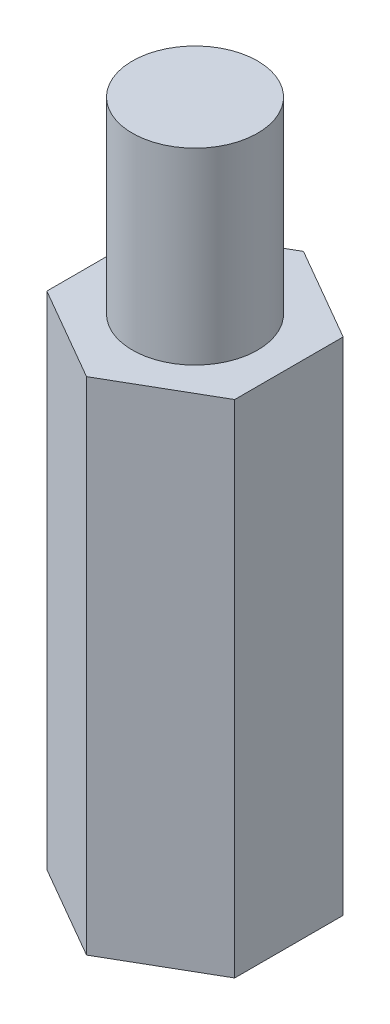
ISO-10303-21;
HEADER;
FILE_DESCRIPTION(('STEP AP214'),'2;1');
FILE_NAME('part.step','',(''),(''),'','','');
FILE_SCHEMA(('AUTOMOTIVE_DESIGN { 1 0 10303 214 1 1 1 1 }'));
ENDSEC;
DATA;
#1=APPLICATION_CONTEXT('core data for automotive mechanical design processes');
#2=APPLICATION_PROTOCOL_DEFINITION('international standard','automotive_design',2000,#1);
#3=PRODUCT_CONTEXT('',#1,'mechanical');
#4=PRODUCT('Part','Part','',(#3));
#5=PRODUCT_RELATED_PRODUCT_CATEGORY('part','',(#4));
#6=PRODUCT_DEFINITION_FORMATION('','',#4);
#7=PRODUCT_DEFINITION_CONTEXT('part definition',#1,'design');
#8=PRODUCT_DEFINITION('design','',#6,#7);
#9=PRODUCT_DEFINITION_SHAPE('','',#8);
#10=(LENGTH_UNIT() NAMED_UNIT(*) SI_UNIT(.MILLI.,.METRE.));
#11=(NAMED_UNIT(*) PLANE_ANGLE_UNIT() SI_UNIT($,.RADIAN.));
#12=(NAMED_UNIT(*) SI_UNIT($,.STERADIAN.) SOLID_ANGLE_UNIT());
#13=UNCERTAINTY_MEASURE_WITH_UNIT(LENGTH_MEASURE(1.E-05),#10,'distance_accuracy_value','');
#14=(GEOMETRIC_REPRESENTATION_CONTEXT(3) GLOBAL_UNCERTAINTY_ASSIGNED_CONTEXT((#13)) GLOBAL_UNIT_ASSIGNED_CONTEXT((#10,
#11,#12)) REPRESENTATION_CONTEXT('',''));
#15=CARTESIAN_POINT('',(0.,0.,0.));
#16=DIRECTION('',(0.,0.,1.));
#17=DIRECTION('',(1.,0.,0.));
#18=AXIS2_PLACEMENT_3D('',#15,#16,#17);
#19=CARTESIAN_POINT('',(4.7625,25.4,-2.74963065701559));
#20=DIRECTION('',(-0.5,0.,0.866025403784439));
#21=DIRECTION('',(0.866025403784439,0.,0.5));
#22=AXIS2_PLACEMENT_3D('',#19,#20,#21);
#23=PLANE('',#22);
#24=DIRECTION('',(-0.866025403784439,0.,-0.5));
#25=VECTOR('',#24,1.);
#26=CARTESIAN_POINT('',(4.7625,0.,-2.74963065701559));
#27=LINE('',#26,#25);
#28=CARTESIAN_POINT('',(4.7625,0.,-2.74963065701559));
#29=VERTEX_POINT('',#28);
#30=CARTESIAN_POINT('',(0.,0.,-5.49926131403118));
#31=VERTEX_POINT('',#30);
#32=EDGE_CURVE('E116',#29,#31,#27,.T.);
#33=ORIENTED_EDGE('',*,*,#32,.T.);
#34=DIRECTION('',(0.,-1.,0.));
#35=VECTOR('',#34,1.);
#36=CARTESIAN_POINT('',(0.,25.4,-5.49926131403118));
#37=LINE('',#36,#35);
#38=CARTESIAN_POINT('',(0.,25.4,-5.49926131403118));
#39=VERTEX_POINT('',#38);
#40=EDGE_CURVE('E11',#39,#31,#37,.T.);
#41=ORIENTED_EDGE('',*,*,#40,.F.);
#42=DIRECTION('',(-0.866025403784439,0.,-0.5));
#43=VECTOR('',#42,1.);
#44=CARTESIAN_POINT('',(4.7625,25.4,-2.74963065701559));
#45=LINE('',#44,#43);
#46=CARTESIAN_POINT('',(4.7625,25.4,-2.74963065701559));
#47=VERTEX_POINT('',#46);
#48=EDGE_CURVE('E127',#47,#39,#45,.T.);
#49=ORIENTED_EDGE('',*,*,#48,.F.);
#50=DIRECTION('',(0.,-1.,0.));
#51=VECTOR('',#50,1.);
#52=CARTESIAN_POINT('',(4.7625,25.4,-2.74963065701559));
#53=LINE('',#52,#51);
#54=EDGE_CURVE('E112',#47,#29,#53,.T.);
#55=ORIENTED_EDGE('',*,*,#54,.T.);
#56=EDGE_LOOP('',(#33,#41,#49,#55));
#57=FACE_BOUND('',#56,.T.);
#58=ADVANCED_FACE('F32',(#57),#23,.F.);
#59=CARTESIAN_POINT('',(0.,25.4,-5.49926131403118));
#60=DIRECTION('',(0.5,0.,0.866025403784439));
#61=DIRECTION('',(0.866025403784439,0.,-0.5));
#62=AXIS2_PLACEMENT_3D('',#59,#60,#61);
#63=PLANE('',#62);
#64=DIRECTION('',(-0.866025403784439,0.,0.5));
#65=VECTOR('',#64,1.);
#66=CARTESIAN_POINT('',(0.,0.,-5.49926131403118));
#67=LINE('',#66,#65);
#68=CARTESIAN_POINT('',(-4.7625,0.,-2.74963065701559));
#69=VERTEX_POINT('',#68);
#70=EDGE_CURVE('E119',#31,#69,#67,.T.);
#71=ORIENTED_EDGE('',*,*,#70,.T.);
#72=DIRECTION('',(0.,-1.,0.));
#73=VECTOR('',#72,1.);
#74=CARTESIAN_POINT('',(-4.7625,25.4,-2.74963065701559));
#75=LINE('',#74,#73);
#76=CARTESIAN_POINT('',(-4.7625,25.4,-2.74963065701559));
#77=VERTEX_POINT('',#76);
#78=EDGE_CURVE('E40',#77,#69,#75,.T.);
#79=ORIENTED_EDGE('',*,*,#78,.F.);
#80=DIRECTION('',(-0.866025403784439,0.,0.5));
#81=VECTOR('',#80,1.);
#82=CARTESIAN_POINT('',(0.,25.4,-5.49926131403118));
#83=LINE('',#82,#81);
#84=EDGE_CURVE('E85',#39,#77,#83,.T.);
#85=ORIENTED_EDGE('',*,*,#84,.F.);
#86=ORIENTED_EDGE('',*,*,#40,.T.);
#87=EDGE_LOOP('',(#71,#79,#85,#86));
#88=FACE_BOUND('',#87,.T.);
#89=ADVANCED_FACE('F152',(#88),#63,.F.);
#90=CARTESIAN_POINT('',(-4.7625,25.4,-2.74963065701559));
#91=DIRECTION('',(1.,0.,0.));
#92=DIRECTION('',(0.,0.,-1.));
#93=AXIS2_PLACEMENT_3D('',#90,#91,#92);
#94=PLANE('',#93);
#95=DIRECTION('',(0.,0.,1.));
#96=VECTOR('',#95,1.);
#97=CARTESIAN_POINT('',(-4.7625,0.,-2.74963065701559));
#98=LINE('',#97,#96);
#99=CARTESIAN_POINT('',(-4.7625,0.,2.74963065701559));
#100=VERTEX_POINT('',#99);
#101=EDGE_CURVE('E122',#69,#100,#98,.T.);
#102=ORIENTED_EDGE('',*,*,#101,.T.);
#103=DIRECTION('',(0.,-1.,0.));
#104=VECTOR('',#103,1.);
#105=CARTESIAN_POINT('',(-4.7625,25.4,2.74963065701559));
#106=LINE('',#105,#104);
#107=CARTESIAN_POINT('',(-4.7625,25.4,2.74963065701559));
#108=VERTEX_POINT('',#107);
#109=EDGE_CURVE('E107',#108,#100,#106,.T.);
#110=ORIENTED_EDGE('',*,*,#109,.F.);
#111=DIRECTION('',(0.,0.,1.));
#112=VECTOR('',#111,1.);
#113=CARTESIAN_POINT('',(-4.7625,25.4,-2.74963065701559));
#114=LINE('',#113,#112);
#115=EDGE_CURVE('E98',#77,#108,#114,.T.);
#116=ORIENTED_EDGE('',*,*,#115,.F.);
#117=ORIENTED_EDGE('',*,*,#78,.T.);
#118=EDGE_LOOP('',(#102,#110,#116,#117));
#119=FACE_BOUND('',#118,.T.);
#120=ADVANCED_FACE('F133',(#119),#94,.F.);
#121=CARTESIAN_POINT('',(-4.7625,25.4,2.74963065701559));
#122=DIRECTION('',(0.5,0.,-0.866025403784439));
#123=DIRECTION('',(-0.866025403784439,0.,-0.5));
#124=AXIS2_PLACEMENT_3D('',#121,#122,#123);
#125=PLANE('',#124);
#126=DIRECTION('',(0.866025403784439,0.,0.5));
#127=VECTOR('',#126,1.);
#128=CARTESIAN_POINT('',(-4.7625,0.,2.74963065701559));
#129=LINE('',#128,#127);
#130=CARTESIAN_POINT('',(0.,0.,5.49926131403118));
#131=VERTEX_POINT('',#130);
#132=EDGE_CURVE('E106',#100,#131,#129,.T.);
#133=ORIENTED_EDGE('',*,*,#132,.T.);
#134=DIRECTION('',(0.,-1.,0.));
#135=VECTOR('',#134,1.);
#136=CARTESIAN_POINT('',(0.,25.4,5.49926131403118));
#137=LINE('',#136,#135);
#138=CARTESIAN_POINT('',(0.,25.4,5.49926131403118));
#139=VERTEX_POINT('',#138);
#140=EDGE_CURVE('E103',#139,#131,#137,.T.);
#141=ORIENTED_EDGE('',*,*,#140,.F.);
#142=DIRECTION('',(0.866025403784439,0.,0.5));
#143=VECTOR('',#142,1.);
#144=CARTESIAN_POINT('',(-4.7625,25.4,2.74963065701559));
#145=LINE('',#144,#143);
#146=EDGE_CURVE('E92',#108,#139,#145,.T.);
#147=ORIENTED_EDGE('',*,*,#146,.F.);
#148=ORIENTED_EDGE('',*,*,#109,.T.);
#149=EDGE_LOOP('',(#133,#141,#147,#148));
#150=FACE_BOUND('',#149,.T.);
#151=ADVANCED_FACE('F104',(#150),#125,.F.);
#152=CARTESIAN_POINT('',(0.,25.4,5.49926131403118));
#153=DIRECTION('',(-0.5,0.,-0.866025403784439));
#154=DIRECTION('',(-0.866025403784439,0.,0.5));
#155=AXIS2_PLACEMENT_3D('',#152,#153,#154);
#156=PLANE('',#155);
#157=DIRECTION('',(0.866025403784439,0.,-0.5));
#158=VECTOR('',#157,1.);
#159=CARTESIAN_POINT('',(0.,0.,5.49926131403118));
#160=LINE('',#159,#158);
#161=CARTESIAN_POINT('',(4.7625,0.,2.74963065701559));
#162=VERTEX_POINT('',#161);
#163=EDGE_CURVE('E71',#131,#162,#160,.T.);
#164=ORIENTED_EDGE('',*,*,#163,.T.);
#165=DIRECTION('',(0.,-1.,0.));
#166=VECTOR('',#165,1.);
#167=CARTESIAN_POINT('',(4.7625,25.4,2.74963065701559));
#168=LINE('',#167,#166);
#169=CARTESIAN_POINT('',(4.7625,25.4,2.74963065701559));
#170=VERTEX_POINT('',#169);
#171=EDGE_CURVE('E108',#170,#162,#168,.T.);
#172=ORIENTED_EDGE('',*,*,#171,.F.);
#173=DIRECTION('',(0.866025403784439,0.,-0.5));
#174=VECTOR('',#173,1.);
#175=CARTESIAN_POINT('',(0.,25.4,5.49926131403118));
#176=LINE('',#175,#174);
#177=EDGE_CURVE('E96',#139,#170,#176,.T.);
#178=ORIENTED_EDGE('',*,*,#177,.F.);
#179=ORIENTED_EDGE('',*,*,#140,.T.);
#180=EDGE_LOOP('',(#164,#172,#178,#179));
#181=FACE_BOUND('',#180,.T.);
#182=ADVANCED_FACE('F110',(#181),#156,.F.);
#183=CARTESIAN_POINT('',(4.7625,25.4,2.74963065701559));
#184=DIRECTION('',(-1.,0.,0.));
#185=DIRECTION('',(0.,0.,1.));
#186=AXIS2_PLACEMENT_3D('',#183,#184,#185);
#187=PLANE('',#186);
#188=DIRECTION('',(0.,0.,-1.));
#189=VECTOR('',#188,1.);
#190=CARTESIAN_POINT('',(4.7625,0.,2.74963065701559));
#191=LINE('',#190,#189);
#192=EDGE_CURVE('E77',#162,#29,#191,.T.);
#193=ORIENTED_EDGE('',*,*,#192,.T.);
#194=ORIENTED_EDGE('',*,*,#54,.F.);
#195=DIRECTION('',(0.,0.,-1.));
#196=VECTOR('',#195,1.);
#197=CARTESIAN_POINT('',(4.7625,25.4,2.74963065701559));
#198=LINE('',#197,#196);
#199=EDGE_CURVE('E48',#170,#47,#198,.T.);
#200=ORIENTED_EDGE('',*,*,#199,.F.);
#201=ORIENTED_EDGE('',*,*,#171,.T.);
#202=EDGE_LOOP('',(#193,#194,#200,#201));
#203=FACE_BOUND('',#202,.T.);
#204=ADVANCED_FACE('F140',(#203),#187,.F.);
#205=CARTESIAN_POINT('',(0.,25.4,0.));
#206=DIRECTION('',(0.,1.,0.));
#207=DIRECTION('',(0.,0.,1.));
#208=AXIS2_PLACEMENT_3D('',#205,#206,#207);
#209=PLANE('',#208);
#210=CARTESIAN_POINT('',(0.,25.4,0.));
#211=DIRECTION('',(0.,1.,0.));
#212=DIRECTION('',(0.,0.,1.));
#213=AXIS2_PLACEMENT_3D('',#210,#211,#212);
#214=CIRCLE('',#213,3.175);
#215=CARTESIAN_POINT('',(0.,25.4,-3.175));
#216=VERTEX_POINT('',#215);
#217=EDGE_CURVE('E236',#216,#216,#214,.T.);
#218=ORIENTED_EDGE('',*,*,#217,.F.);
#219=EDGE_LOOP('',(#218));
#220=FACE_BOUND('',#219,.T.);
#221=ORIENTED_EDGE('',*,*,#48,.T.);
#222=ORIENTED_EDGE('',*,*,#84,.T.);
#223=ORIENTED_EDGE('',*,*,#115,.T.);
#224=ORIENTED_EDGE('',*,*,#146,.T.);
#225=ORIENTED_EDGE('',*,*,#177,.T.);
#226=ORIENTED_EDGE('',*,*,#199,.T.);
#227=EDGE_LOOP('',(#221,#222,#223,#224,#225,#226));
#228=FACE_BOUND('',#227,.T.);
#229=ADVANCED_FACE('F94',(#220,#228),#209,.T.);
#230=CARTESIAN_POINT('',(0.,0.,0.));
#231=DIRECTION('',(0.,1.,0.));
#232=DIRECTION('',(0.,0.,1.));
#233=AXIS2_PLACEMENT_3D('',#230,#231,#232);
#234=PLANE('',#233);
#235=CARTESIAN_POINT('',(0.,0.,0.));
#236=DIRECTION('',(0.,-1.,0.));
#237=DIRECTION('',(0.,0.,-1.));
#238=AXIS2_PLACEMENT_3D('',#235,#236,#237);
#239=CIRCLE('',#238,3.175);
#240=CARTESIAN_POINT('',(0.,0.,-3.175));
#241=VERTEX_POINT('',#240);
#242=EDGE_CURVE('E235',#241,#241,#239,.T.);
#243=ORIENTED_EDGE('',*,*,#242,.F.);
#244=EDGE_LOOP('',(#243));
#245=FACE_BOUND('',#244,.T.);
#246=ORIENTED_EDGE('',*,*,#32,.F.);
#247=ORIENTED_EDGE('',*,*,#192,.F.);
#248=ORIENTED_EDGE('',*,*,#163,.F.);
#249=ORIENTED_EDGE('',*,*,#132,.F.);
#250=ORIENTED_EDGE('',*,*,#101,.F.);
#251=ORIENTED_EDGE('',*,*,#70,.F.);
#252=EDGE_LOOP('',(#246,#247,#248,#249,#250,#251));
#253=FACE_BOUND('',#252,.T.);
#254=ADVANCED_FACE('F136',(#245,#253),#234,.F.);
#255=CARTESIAN_POINT('',(0.,12.7,0.));
#256=DIRECTION('',(0.,-1.,0.));
#257=DIRECTION('',(0.,0.,-1.));
#258=AXIS2_PLACEMENT_3D('',#255,#256,#257);
#259=CYLINDRICAL_SURFACE('',#258,3.175);
#260=CARTESIAN_POINT('',(0.,12.7,0.));
#261=DIRECTION('',(0.,-1.,0.));
#262=DIRECTION('',(0.,0.,-1.));
#263=AXIS2_PLACEMENT_3D('',#260,#261,#262);
#264=CIRCLE('',#263,3.175);
#265=CARTESIAN_POINT('',(0.,12.7,-3.175));
#266=VERTEX_POINT('',#265);
#267=EDGE_CURVE('E120',#266,#266,#264,.T.);
#268=ORIENTED_EDGE('',*,*,#267,.F.);
#269=EDGE_LOOP('',(#268));
#270=FACE_BOUND('',#269,.T.);
#271=ORIENTED_EDGE('',*,*,#242,.T.);
#272=EDGE_LOOP('',(#271));
#273=FACE_BOUND('',#272,.T.);
#274=ADVANCED_FACE('F184',(#270,#273),#259,.F.);
#275=CARTESIAN_POINT('',(0.,12.7,0.));
#276=DIRECTION('',(0.,-1.,0.));
#277=DIRECTION('',(0.,0.,-1.));
#278=AXIS2_PLACEMENT_3D('',#275,#276,#277);
#279=PLANE('',#278);
#280=ORIENTED_EDGE('',*,*,#267,.T.);
#281=EDGE_LOOP('',(#280));
#282=FACE_BOUND('',#281,.T.);
#283=ADVANCED_FACE('F193',(#282),#279,.T.);
#284=CARTESIAN_POINT('',(0.,34.925,0.));
#285=DIRECTION('',(0.,-1.,0.));
#286=DIRECTION('',(0.,0.,-1.));
#287=AXIS2_PLACEMENT_3D('',#284,#285,#286);
#288=CYLINDRICAL_SURFACE('',#287,3.175);
#289=CARTESIAN_POINT('',(0.,34.925,0.));
#290=DIRECTION('',(0.,1.,0.));
#291=DIRECTION('',(0.,0.,1.));
#292=AXIS2_PLACEMENT_3D('',#289,#290,#291);
#293=CIRCLE('',#292,3.175);
#294=CARTESIAN_POINT('',(0.,34.925,-3.175));
#295=VERTEX_POINT('',#294);
#296=EDGE_CURVE('E234',#295,#295,#293,.T.);
#297=CARTESIAN_POINT('',(0.,34.925,-3.175));
#298=CARTESIAN_POINT('',(0.,34.82578125,-3.175));
#299=CARTESIAN_POINT('',(0.,34.7265625,-3.175));
#300=CARTESIAN_POINT('',(0.,34.528125,-3.175));
#301=CARTESIAN_POINT('',(0.,34.42890625,-3.175));
#302=CARTESIAN_POINT('',(0.,34.23046875,-3.175));
#303=CARTESIAN_POINT('',(0.,34.13125,-3.175));
#304=CARTESIAN_POINT('',(0.,33.9328125,-3.175));
#305=CARTESIAN_POINT('',(0.,33.83359375,-3.175));
#306=CARTESIAN_POINT('',(0.,33.63515625,-3.175));
#307=CARTESIAN_POINT('',(0.,33.5359375,-3.175));
#308=CARTESIAN_POINT('',(0.,33.3375,-3.175));
#309=CARTESIAN_POINT('',(0.,33.23828125,-3.175));
#310=CARTESIAN_POINT('',(0.,33.03984375,-3.175));
#311=CARTESIAN_POINT('',(0.,32.940625,-3.175));
#312=CARTESIAN_POINT('',(0.,32.7421875,-3.175));
#313=CARTESIAN_POINT('',(0.,32.64296875,-3.175));
#314=CARTESIAN_POINT('',(0.,32.44453125,-3.175));
#315=CARTESIAN_POINT('',(0.,32.3453125,-3.175));
#316=CARTESIAN_POINT('',(0.,32.146875,-3.175));
#317=CARTESIAN_POINT('',(0.,32.04765625,-3.175));
#318=CARTESIAN_POINT('',(0.,31.84921875,-3.175));
#319=CARTESIAN_POINT('',(0.,31.75,-3.175));
#320=CARTESIAN_POINT('',(0.,31.5515625,-3.175));
#321=CARTESIAN_POINT('',(0.,31.45234375,-3.175));
#322=CARTESIAN_POINT('',(0.,31.25390625,-3.175));
#323=CARTESIAN_POINT('',(0.,31.1546875,-3.175));
#324=CARTESIAN_POINT('',(0.,30.95625,-3.175));
#325=CARTESIAN_POINT('',(0.,30.85703125,-3.175));
#326=CARTESIAN_POINT('',(0.,30.65859375,-3.175));
#327=CARTESIAN_POINT('',(0.,30.559375,-3.175));
#328=CARTESIAN_POINT('',(0.,30.3609375,-3.175));
#329=CARTESIAN_POINT('',(0.,30.26171875,-3.175));
#330=CARTESIAN_POINT('',(0.,30.06328125,-3.175));
#331=CARTESIAN_POINT('',(0.,29.9640625,-3.175));
#332=CARTESIAN_POINT('',(0.,29.765625,-3.175));
#333=CARTESIAN_POINT('',(0.,29.66640625,-3.175));
#334=CARTESIAN_POINT('',(0.,29.46796875,-3.175));
#335=CARTESIAN_POINT('',(0.,29.36875,-3.175));
#336=CARTESIAN_POINT('',(0.,29.1703125,-3.175));
#337=CARTESIAN_POINT('',(0.,29.07109375,-3.175));
#338=CARTESIAN_POINT('',(0.,28.87265625,-3.175));
#339=CARTESIAN_POINT('',(0.,28.7734375,-3.175));
#340=CARTESIAN_POINT('',(0.,28.575,-3.175));
#341=CARTESIAN_POINT('',(0.,28.47578125,-3.175));
#342=CARTESIAN_POINT('',(0.,28.27734375,-3.175));
#343=CARTESIAN_POINT('',(0.,28.178125,-3.175));
#344=CARTESIAN_POINT('',(0.,27.9796875,-3.175));
#345=CARTESIAN_POINT('',(0.,27.88046875,-3.175));
#346=CARTESIAN_POINT('',(0.,27.68203125,-3.175));
#347=CARTESIAN_POINT('',(0.,27.5828125,-3.175));
#348=CARTESIAN_POINT('',(0.,27.384375,-3.175));
#349=CARTESIAN_POINT('',(0.,27.28515625,-3.175));
#350=CARTESIAN_POINT('',(0.,27.08671875,-3.175));
#351=CARTESIAN_POINT('',(0.,26.9875,-3.175));
#352=CARTESIAN_POINT('',(0.,26.7890625,-3.175));
#353=CARTESIAN_POINT('',(0.,26.68984375,-3.175));
#354=CARTESIAN_POINT('',(0.,26.49140625,-3.175));
#355=CARTESIAN_POINT('',(0.,26.3921875,-3.175));
#356=CARTESIAN_POINT('',(0.,26.19375,-3.175));
#357=CARTESIAN_POINT('',(0.,26.09453125,-3.175));
#358=CARTESIAN_POINT('',(0.,25.89609375,-3.175));
#359=CARTESIAN_POINT('',(0.,25.796875,-3.175));
#360=CARTESIAN_POINT('',(0.,25.5984375,-3.175));
#361=CARTESIAN_POINT('',(0.,25.49921875,-3.175));
#362=CARTESIAN_POINT('',(0.,25.4,-3.175));
#363=B_SPLINE_CURVE_WITH_KNOTS('',3,(#297,#298,#299,#300,#301,#302,#303,#304,#305,#306,#307,
#308,#309,#310,#311,#312,#313,#314,#315,#316,#317,#318,#319,#320,#321,#322,#323,#324,#325,#326,
#327,#328,#329,#330,#331,#332,#333,#334,#335,#336,#337,#338,#339,#340,#341,#342,#343,#344,#345,
#346,#347,#348,#349,#350,#351,#352,#353,#354,#355,#356,#357,#358,#359,#360,#361,#362),
.UNSPECIFIED.,.F.,.F.,(4,2,2,2,2,2,2,2,2,2,2,2,2,2,2,2,2,2,2,2,2,2,2,2,2,2,2,2,2,2,2,2,4),(0.,
0.297656249999993,0.595312499999993,0.892968749999994,1.19062499999999,1.48828124999999,
1.78593749999999,2.08359374999999,2.38124999999999,2.67890624999999,2.97656249999999,
3.27421874999999,3.571875,3.86953125,4.1671875,4.46484375,4.7625,5.06015625,5.3578125,
5.65546875,5.953125,6.25078125,6.54843749999999,6.84609374999999,7.14374999999999,
7.44140624999999,7.73906249999999,8.03671875,8.33437499999999,8.63203124999999,8.92968749999999,
9.22734374999999,9.52499999999999),.UNSPECIFIED.);
#364=EDGE_CURVE('BSEAM203',#295,#216,#363,.T.);
#365=ORIENTED_EDGE('',*,*,#296,.F.);
#366=ORIENTED_EDGE('',*,*,#217,.T.);
#367=ORIENTED_EDGE('',*,*,#364,.T.);
#368=ORIENTED_EDGE('',*,*,#364,.F.);
#369=EDGE_LOOP('',(#365,#367,#366,#368));
#370=FACE_BOUND('',#369,.T.);
#371=ADVANCED_FACE('F203',(#370),#288,.T.);
#372=CARTESIAN_POINT('',(0.,34.925,0.));
#373=DIRECTION('',(0.,1.,0.));
#374=DIRECTION('',(0.,0.,1.));
#375=AXIS2_PLACEMENT_3D('',#372,#373,#374);
#376=PLANE('',#375);
#377=ORIENTED_EDGE('',*,*,#296,.T.);
#378=EDGE_LOOP('',(#377));
#379=FACE_BOUND('',#378,.T.);
#380=ADVANCED_FACE('F218',(#379),#376,.T.);
#381=CLOSED_SHELL('',(#58,#89,#120,#151,#182,#204,#229,#254,#274,#283,#371,#380));
#382=MANIFOLD_SOLID_BREP('B2',#381);
#383=ADVANCED_BREP_SHAPE_REPRESENTATION('',(#18,#382),#14);
#384=SHAPE_DEFINITION_REPRESENTATION(#9,#383);
ENDSEC;
END-ISO-10303-21;
